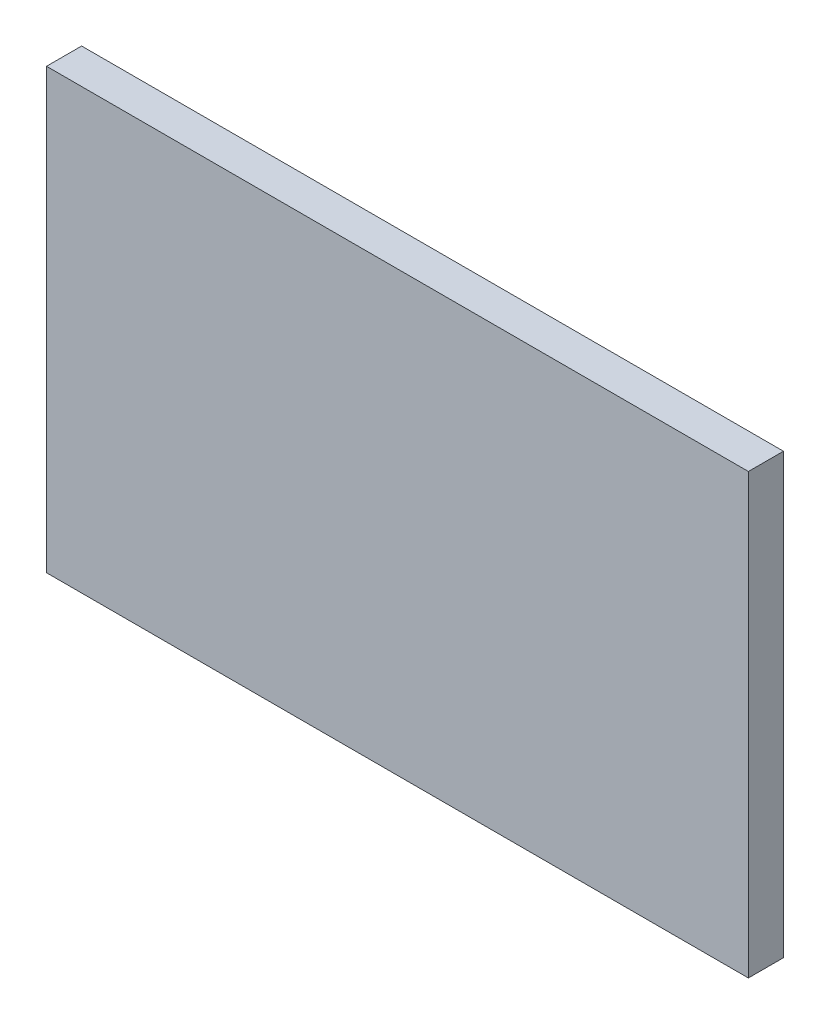
ISO-10303-21;
HEADER;
FILE_DESCRIPTION(('STEP AP214'),'2;1');
FILE_NAME('part.step','',(''),(''),'','','');
FILE_SCHEMA(('AUTOMOTIVE_DESIGN { 1 0 10303 214 1 1 1 1 }'));
ENDSEC;
DATA;
#1=APPLICATION_CONTEXT('core data for automotive mechanical design processes');
#2=APPLICATION_PROTOCOL_DEFINITION('international standard','automotive_design',2000,#1);
#3=PRODUCT_CONTEXT('',#1,'mechanical');
#4=PRODUCT('Part','Part','',(#3));
#5=PRODUCT_RELATED_PRODUCT_CATEGORY('part','',(#4));
#6=PRODUCT_DEFINITION_FORMATION('','',#4);
#7=PRODUCT_DEFINITION_CONTEXT('part definition',#1,'design');
#8=PRODUCT_DEFINITION('design','',#6,#7);
#9=PRODUCT_DEFINITION_SHAPE('','',#8);
#10=(LENGTH_UNIT() NAMED_UNIT(*) SI_UNIT(.MILLI.,.METRE.));
#11=(NAMED_UNIT(*) PLANE_ANGLE_UNIT() SI_UNIT($,.RADIAN.));
#12=(NAMED_UNIT(*) SI_UNIT($,.STERADIAN.) SOLID_ANGLE_UNIT());
#13=UNCERTAINTY_MEASURE_WITH_UNIT(LENGTH_MEASURE(1.E-05),#10,'distance_accuracy_value','');
#14=(GEOMETRIC_REPRESENTATION_CONTEXT(3) GLOBAL_UNCERTAINTY_ASSIGNED_CONTEXT((#13)) GLOBAL_UNIT_ASSIGNED_CONTEXT((#10,
#11,#12)) REPRESENTATION_CONTEXT('',''));
#15=CARTESIAN_POINT('',(0.,0.,0.));
#16=DIRECTION('',(0.,0.,1.));
#17=DIRECTION('',(1.,0.,0.));
#18=AXIS2_PLACEMENT_3D('',#15,#16,#17);
#19=CARTESIAN_POINT('',(500.,-312.5,50.));
#20=DIRECTION('',(-1.,0.,0.));
#21=DIRECTION('',(0.,0.,1.));
#22=AXIS2_PLACEMENT_3D('',#19,#20,#21);
#23=PLANE('',#22);
#24=DIRECTION('',(0.,1.,0.));
#25=VECTOR('',#24,1.);
#26=CARTESIAN_POINT('',(500.,-312.5,0.));
#27=LINE('',#26,#25);
#28=CARTESIAN_POINT('',(500.,-312.5,0.));
#29=VERTEX_POINT('',#28);
#30=CARTESIAN_POINT('',(500.,312.5,0.));
#31=VERTEX_POINT('',#30);
#32=EDGE_CURVE('E107',#29,#31,#27,.T.);
#33=ORIENTED_EDGE('',*,*,#32,.T.);
#34=DIRECTION('',(0.,0.,-1.));
#35=VECTOR('',#34,1.);
#36=CARTESIAN_POINT('',(500.,312.5,50.));
#37=LINE('',#36,#35);
#38=CARTESIAN_POINT('',(500.,312.5,50.));
#39=VERTEX_POINT('',#38);
#40=EDGE_CURVE('E11',#39,#31,#37,.T.);
#41=ORIENTED_EDGE('',*,*,#40,.F.);
#42=DIRECTION('',(0.,1.,0.));
#43=VECTOR('',#42,1.);
#44=CARTESIAN_POINT('',(500.,-312.5,50.));
#45=LINE('',#44,#43);
#46=CARTESIAN_POINT('',(500.,-312.5,50.));
#47=VERTEX_POINT('',#46);
#48=EDGE_CURVE('E91',#47,#39,#45,.T.);
#49=ORIENTED_EDGE('',*,*,#48,.F.);
#50=DIRECTION('',(0.,0.,-1.));
#51=VECTOR('',#50,1.);
#52=CARTESIAN_POINT('',(500.,-312.5,50.));
#53=LINE('',#52,#51);
#54=EDGE_CURVE('E103',#47,#29,#53,.T.);
#55=ORIENTED_EDGE('',*,*,#54,.T.);
#56=EDGE_LOOP('',(#33,#41,#49,#55));
#57=FACE_BOUND('',#56,.T.);
#58=ADVANCED_FACE('F39',(#57),#23,.F.);
#59=CARTESIAN_POINT('',(-500.,312.5,50.));
#60=DIRECTION('',(0.,-1.,0.));
#61=DIRECTION('',(0.,0.,-1.));
#62=AXIS2_PLACEMENT_3D('',#59,#60,#61);
#63=PLANE('',#62);
#64=DIRECTION('',(-1.,0.,0.));
#65=VECTOR('',#64,1.);
#66=CARTESIAN_POINT('',(-500.,312.5,0.));
#67=LINE('',#66,#65);
#68=CARTESIAN_POINT('',(-500.,312.5,0.));
#69=VERTEX_POINT('',#68);
#70=EDGE_CURVE('E96',#31,#69,#67,.T.);
#71=ORIENTED_EDGE('',*,*,#70,.T.);
#72=DIRECTION('',(0.,0.,-1.));
#73=VECTOR('',#72,1.);
#74=CARTESIAN_POINT('',(-500.,312.5,50.));
#75=LINE('',#74,#73);
#76=CARTESIAN_POINT('',(-500.,312.5,50.));
#77=VERTEX_POINT('',#76);
#78=EDGE_CURVE('E48',#77,#69,#75,.T.);
#79=ORIENTED_EDGE('',*,*,#78,.F.);
#80=DIRECTION('',(-1.,0.,0.));
#81=VECTOR('',#80,1.);
#82=CARTESIAN_POINT('',(-500.,312.5,50.));
#83=LINE('',#82,#81);
#84=EDGE_CURVE('E86',#39,#77,#83,.T.);
#85=ORIENTED_EDGE('',*,*,#84,.F.);
#86=ORIENTED_EDGE('',*,*,#40,.T.);
#87=EDGE_LOOP('',(#71,#79,#85,#86));
#88=FACE_BOUND('',#87,.T.);
#89=ADVANCED_FACE('F95',(#88),#63,.F.);
#90=CARTESIAN_POINT('',(-500.,-312.5,50.));
#91=DIRECTION('',(1.,0.,0.));
#92=DIRECTION('',(0.,0.,-1.));
#93=AXIS2_PLACEMENT_3D('',#90,#91,#92);
#94=PLANE('',#93);
#95=DIRECTION('',(0.,-1.,0.));
#96=VECTOR('',#95,1.);
#97=CARTESIAN_POINT('',(-500.,-312.5,0.));
#98=LINE('',#97,#96);
#99=CARTESIAN_POINT('',(-500.,-312.5,0.));
#100=VERTEX_POINT('',#99);
#101=EDGE_CURVE('E73',#69,#100,#98,.T.);
#102=ORIENTED_EDGE('',*,*,#101,.T.);
#103=DIRECTION('',(0.,0.,-1.));
#104=VECTOR('',#103,1.);
#105=CARTESIAN_POINT('',(-500.,-312.5,50.));
#106=LINE('',#105,#104);
#107=CARTESIAN_POINT('',(-500.,-312.5,50.));
#108=VERTEX_POINT('',#107);
#109=EDGE_CURVE('E98',#108,#100,#106,.T.);
#110=ORIENTED_EDGE('',*,*,#109,.F.);
#111=DIRECTION('',(0.,-1.,0.));
#112=VECTOR('',#111,1.);
#113=CARTESIAN_POINT('',(-500.,-312.5,50.));
#114=LINE('',#113,#112);
#115=EDGE_CURVE('E89',#77,#108,#114,.T.);
#116=ORIENTED_EDGE('',*,*,#115,.F.);
#117=ORIENTED_EDGE('',*,*,#78,.T.);
#118=EDGE_LOOP('',(#102,#110,#116,#117));
#119=FACE_BOUND('',#118,.T.);
#120=ADVANCED_FACE('F99',(#119),#94,.F.);
#121=CARTESIAN_POINT('',(-500.,-312.5,50.));
#122=DIRECTION('',(0.,1.,0.));
#123=DIRECTION('',(0.,0.,1.));
#124=AXIS2_PLACEMENT_3D('',#121,#122,#123);
#125=PLANE('',#124);
#126=DIRECTION('',(1.,0.,0.));
#127=VECTOR('',#126,1.);
#128=CARTESIAN_POINT('',(-500.,-312.5,0.));
#129=LINE('',#128,#127);
#130=EDGE_CURVE('E79',#100,#29,#129,.T.);
#131=ORIENTED_EDGE('',*,*,#130,.T.);
#132=ORIENTED_EDGE('',*,*,#54,.F.);
#133=DIRECTION('',(1.,0.,0.));
#134=VECTOR('',#133,1.);
#135=CARTESIAN_POINT('',(-500.,-312.5,50.));
#136=LINE('',#135,#134);
#137=EDGE_CURVE('E56',#108,#47,#136,.T.);
#138=ORIENTED_EDGE('',*,*,#137,.F.);
#139=ORIENTED_EDGE('',*,*,#109,.T.);
#140=EDGE_LOOP('',(#131,#132,#138,#139));
#141=FACE_BOUND('',#140,.T.);
#142=ADVANCED_FACE('F120',(#141),#125,.F.);
#143=CARTESIAN_POINT('',(0.,0.,50.));
#144=DIRECTION('',(0.,0.,-1.));
#145=DIRECTION('',(-1.,0.,0.));
#146=AXIS2_PLACEMENT_3D('',#143,#144,#145);
#147=PLANE('',#146);
#148=ORIENTED_EDGE('',*,*,#48,.T.);
#149=ORIENTED_EDGE('',*,*,#84,.T.);
#150=ORIENTED_EDGE('',*,*,#115,.T.);
#151=ORIENTED_EDGE('',*,*,#137,.T.);
#152=EDGE_LOOP('',(#148,#149,#150,#151));
#153=FACE_BOUND('',#152,.T.);
#154=ADVANCED_FACE('F87',(#153),#147,.F.);
#155=CARTESIAN_POINT('',(0.,0.,0.));
#156=DIRECTION('',(0.,0.,-1.));
#157=DIRECTION('',(-1.,0.,0.));
#158=AXIS2_PLACEMENT_3D('',#155,#156,#157);
#159=PLANE('',#158);
#160=ORIENTED_EDGE('',*,*,#32,.F.);
#161=ORIENTED_EDGE('',*,*,#130,.F.);
#162=ORIENTED_EDGE('',*,*,#101,.F.);
#163=ORIENTED_EDGE('',*,*,#70,.F.);
#164=EDGE_LOOP('',(#160,#161,#162,#163));
#165=FACE_BOUND('',#164,.T.);
#166=ADVANCED_FACE('F123',(#165),#159,.T.);
#167=CLOSED_SHELL('',(#58,#89,#120,#142,#154,#166));
#168=MANIFOLD_SOLID_BREP('B2',#167);
#169=ADVANCED_BREP_SHAPE_REPRESENTATION('',(#18,#168),#14);
#170=SHAPE_DEFINITION_REPRESENTATION(#9,#169);
ENDSEC;
END-ISO-10303-21;
